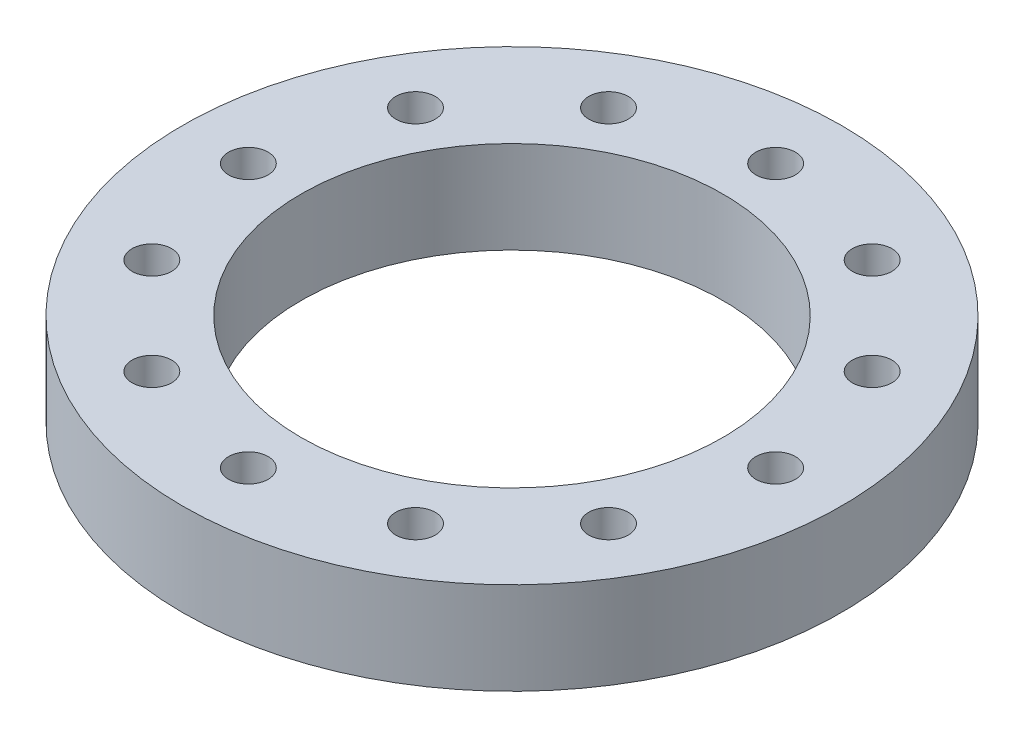
ISO-10303-21;
HEADER;
FILE_DESCRIPTION(('STEP AP214'),'2;1');
FILE_NAME('part.step','',(''),(''),'','','');
FILE_SCHEMA(('AUTOMOTIVE_DESIGN { 1 0 10303 214 1 1 1 1 }'));
ENDSEC;
DATA;
#1=APPLICATION_CONTEXT('core data for automotive mechanical design processes');
#2=APPLICATION_PROTOCOL_DEFINITION('international standard','automotive_design',2000,#1);
#3=PRODUCT_CONTEXT('',#1,'mechanical');
#4=PRODUCT('Part','Part','',(#3));
#5=PRODUCT_RELATED_PRODUCT_CATEGORY('part','',(#4));
#6=PRODUCT_DEFINITION_FORMATION('','',#4);
#7=PRODUCT_DEFINITION_CONTEXT('part definition',#1,'design');
#8=PRODUCT_DEFINITION('design','',#6,#7);
#9=PRODUCT_DEFINITION_SHAPE('','',#8);
#10=(LENGTH_UNIT() NAMED_UNIT(*) SI_UNIT(.MILLI.,.METRE.));
#11=(NAMED_UNIT(*) PLANE_ANGLE_UNIT() SI_UNIT($,.RADIAN.));
#12=(NAMED_UNIT(*) SI_UNIT($,.STERADIAN.) SOLID_ANGLE_UNIT());
#13=UNCERTAINTY_MEASURE_WITH_UNIT(LENGTH_MEASURE(1.E-05),#10,'distance_accuracy_value','');
#14=(GEOMETRIC_REPRESENTATION_CONTEXT(3) GLOBAL_UNCERTAINTY_ASSIGNED_CONTEXT((#13)) GLOBAL_UNIT_ASSIGNED_CONTEXT((#10,
#11,#12)) REPRESENTATION_CONTEXT('',''));
#15=CARTESIAN_POINT('',(0.,0.,0.));
#16=DIRECTION('',(0.,0.,1.));
#17=DIRECTION('',(1.,0.,0.));
#18=AXIS2_PLACEMENT_3D('',#15,#16,#17);
#19=CARTESIAN_POINT('',(0.,7.,0.));
#20=DIRECTION('',(0.,1.,0.));
#21=DIRECTION('',(0.,0.,1.));
#22=AXIS2_PLACEMENT_3D('',#19,#20,#21);
#23=PLANE('',#22);
#24=CARTESIAN_POINT('',(-17.3205080756887,7.,-10.0000000000002));
#25=DIRECTION('',(0.,1.,0.));
#26=DIRECTION('',(0.,0.,1.));
#27=AXIS2_PLACEMENT_3D('',#24,#25,#26);
#28=CIRCLE('',#27,1.5);
#29=CARTESIAN_POINT('',(-17.3205080756887,7.,-8.5000000000002));
#30=VERTEX_POINT('',#29);
#31=EDGE_CURVE('E142',#30,#30,#28,.T.);
#32=ORIENTED_EDGE('',*,*,#31,.F.);
#33=EDGE_LOOP('',(#32));
#34=FACE_BOUND('',#33,.T.);
#35=CARTESIAN_POINT('',(-17.3205080756889,7.,9.99999999999984));
#36=DIRECTION('',(0.,1.,0.));
#37=DIRECTION('',(0.,0.,1.));
#38=AXIS2_PLACEMENT_3D('',#35,#36,#37);
#39=CIRCLE('',#38,1.5);
#40=CARTESIAN_POINT('',(-17.3205080756889,7.,11.4999999999998));
#41=VERTEX_POINT('',#40);
#42=EDGE_CURVE('E126',#41,#41,#39,.T.);
#43=ORIENTED_EDGE('',*,*,#42,.F.);
#44=EDGE_LOOP('',(#43));
#45=FACE_BOUND('',#44,.T.);
#46=CARTESIAN_POINT('',(-1.39659253553725E-13,7.,20.));
#47=DIRECTION('',(0.,1.,0.));
#48=DIRECTION('',(0.,0.,1.));
#49=AXIS2_PLACEMENT_3D('',#46,#47,#48);
#50=CIRCLE('',#49,1.5);
#51=CARTESIAN_POINT('',(-1.39659253553725E-13,7.,21.5));
#52=VERTEX_POINT('',#51);
#53=EDGE_CURVE('E110',#52,#52,#50,.T.);
#54=ORIENTED_EDGE('',*,*,#53,.F.);
#55=EDGE_LOOP('',(#54));
#56=FACE_BOUND('',#55,.T.);
#57=CARTESIAN_POINT('',(17.3205080756887,7.,10.0000000000001));
#58=DIRECTION('',(0.,1.,0.));
#59=DIRECTION('',(0.,0.,1.));
#60=AXIS2_PLACEMENT_3D('',#57,#58,#59);
#61=CIRCLE('',#60,1.5);
#62=CARTESIAN_POINT('',(17.3205080756887,7.,11.5000000000001));
#63=VERTEX_POINT('',#62);
#64=EDGE_CURVE('E94',#63,#63,#61,.T.);
#65=ORIENTED_EDGE('',*,*,#64,.F.);
#66=EDGE_LOOP('',(#65));
#67=FACE_BOUND('',#66,.T.);
#68=CARTESIAN_POINT('',(17.3205080756888,7.,-9.99999999999996));
#69=DIRECTION('',(0.,1.,0.));
#70=DIRECTION('',(0.,0.,1.));
#71=AXIS2_PLACEMENT_3D('',#68,#69,#70);
#72=CIRCLE('',#71,1.5);
#73=CARTESIAN_POINT('',(17.3205080756888,7.,-8.49999999999996));
#74=VERTEX_POINT('',#73);
#75=EDGE_CURVE('E78',#74,#74,#72,.T.);
#76=ORIENTED_EDGE('',*,*,#75,.F.);
#77=EDGE_LOOP('',(#76));
#78=FACE_BOUND('',#77,.T.);
#79=CARTESIAN_POINT('',(0.,7.,-20.));
#80=DIRECTION('',(0.,1.,0.));
#81=DIRECTION('',(0.,0.,1.));
#82=AXIS2_PLACEMENT_3D('',#79,#80,#81);
#83=CIRCLE('',#82,1.5);
#84=CARTESIAN_POINT('',(0.,7.,-18.5));
#85=VERTEX_POINT('',#84);
#86=EDGE_CURVE('E62',#85,#85,#83,.T.);
#87=ORIENTED_EDGE('',*,*,#86,.F.);
#88=EDGE_LOOP('',(#87));
#89=FACE_BOUND('',#88,.T.);
#90=CARTESIAN_POINT('',(0.,7.,0.));
#91=DIRECTION('',(0.,1.,0.));
#92=DIRECTION('',(0.,0.,1.));
#93=AXIS2_PLACEMENT_3D('',#90,#91,#92);
#94=CIRCLE('',#93,25.);
#95=CARTESIAN_POINT('',(0.,7.,25.));
#96=VERTEX_POINT('',#95);
#97=EDGE_CURVE('E10',#96,#96,#94,.T.);
#98=ORIENTED_EDGE('',*,*,#97,.T.);
#99=EDGE_LOOP('',(#98));
#100=FACE_BOUND('',#99,.T.);
#101=CARTESIAN_POINT('',(0.,7.,0.));
#102=DIRECTION('',(0.,1.,0.));
#103=DIRECTION('',(0.,0.,1.));
#104=AXIS2_PLACEMENT_3D('',#101,#102,#103);
#105=CIRCLE('',#104,16.);
#106=CARTESIAN_POINT('',(0.,7.,16.));
#107=VERTEX_POINT('',#106);
#108=EDGE_CURVE('E56',#107,#107,#105,.T.);
#109=ORIENTED_EDGE('',*,*,#108,.F.);
#110=EDGE_LOOP('',(#109));
#111=FACE_BOUND('',#110,.T.);
#112=CARTESIAN_POINT('',(10.,7.,-17.3205080756888));
#113=DIRECTION('',(0.,1.,0.));
#114=DIRECTION('',(0.,0.,1.));
#115=AXIS2_PLACEMENT_3D('',#112,#113,#114);
#116=CIRCLE('',#115,1.5);
#117=CARTESIAN_POINT('',(10.,7.,-15.8205080756888));
#118=VERTEX_POINT('',#117);
#119=EDGE_CURVE('E70',#118,#118,#116,.T.);
#120=ORIENTED_EDGE('',*,*,#119,.F.);
#121=EDGE_LOOP('',(#120));
#122=FACE_BOUND('',#121,.T.);
#123=CARTESIAN_POINT('',(20.,7.,0.));
#124=DIRECTION('',(0.,1.,0.));
#125=DIRECTION('',(0.,0.,1.));
#126=AXIS2_PLACEMENT_3D('',#123,#124,#125);
#127=CIRCLE('',#126,1.5);
#128=CARTESIAN_POINT('',(20.,7.,1.50000000000007));
#129=VERTEX_POINT('',#128);
#130=EDGE_CURVE('E86',#129,#129,#127,.T.);
#131=ORIENTED_EDGE('',*,*,#130,.F.);
#132=EDGE_LOOP('',(#131));
#133=FACE_BOUND('',#132,.T.);
#134=CARTESIAN_POINT('',(9.9999999999999,7.,17.3205080756888));
#135=DIRECTION('',(0.,1.,0.));
#136=DIRECTION('',(0.,0.,1.));
#137=AXIS2_PLACEMENT_3D('',#134,#135,#136);
#138=CIRCLE('',#137,1.5);
#139=CARTESIAN_POINT('',(9.9999999999999,7.,18.8205080756888));
#140=VERTEX_POINT('',#139);
#141=EDGE_CURVE('E102',#140,#140,#138,.T.);
#142=ORIENTED_EDGE('',*,*,#141,.F.);
#143=EDGE_LOOP('',(#142));
#144=FACE_BOUND('',#143,.T.);
#145=CARTESIAN_POINT('',(-10.0000000000001,7.,17.3205080756887));
#146=DIRECTION('',(0.,1.,0.));
#147=DIRECTION('',(0.,0.,1.));
#148=AXIS2_PLACEMENT_3D('',#145,#146,#147);
#149=CIRCLE('',#148,1.5);
#150=CARTESIAN_POINT('',(-10.0000000000001,7.,18.8205080756887));
#151=VERTEX_POINT('',#150);
#152=EDGE_CURVE('E118',#151,#151,#149,.T.);
#153=ORIENTED_EDGE('',*,*,#152,.F.);
#154=EDGE_LOOP('',(#153));
#155=FACE_BOUND('',#154,.T.);
#156=CARTESIAN_POINT('',(-20.,7.,-2.09488880330588E-13));
#157=DIRECTION('',(0.,1.,0.));
#158=DIRECTION('',(0.,0.,1.));
#159=AXIS2_PLACEMENT_3D('',#156,#157,#158);
#160=CIRCLE('',#159,1.5);
#161=CARTESIAN_POINT('',(-20.,7.,1.49999999999979));
#162=VERTEX_POINT('',#161);
#163=EDGE_CURVE('E134',#162,#162,#160,.T.);
#164=ORIENTED_EDGE('',*,*,#163,.F.);
#165=EDGE_LOOP('',(#164));
#166=FACE_BOUND('',#165,.T.);
#167=CARTESIAN_POINT('',(-9.99999999999978,7.,-17.3205080756889));
#168=DIRECTION('',(0.,1.,0.));
#169=DIRECTION('',(0.,0.,1.));
#170=AXIS2_PLACEMENT_3D('',#167,#168,#169);
#171=CIRCLE('',#170,1.5);
#172=CARTESIAN_POINT('',(-9.99999999999978,7.,-15.8205080756889));
#173=VERTEX_POINT('',#172);
#174=EDGE_CURVE('E150',#173,#173,#171,.T.);
#175=ORIENTED_EDGE('',*,*,#174,.F.);
#176=EDGE_LOOP('',(#175));
#177=FACE_BOUND('',#176,.T.);
#178=ADVANCED_FACE('F43',(#34,#45,#56,#67,#78,#89,#100,#111,#122,#133,#144,#155,#166,#177),#23,.T.);
#179=CARTESIAN_POINT('',(0.,0.,0.));
#180=DIRECTION('',(0.,1.,0.));
#181=DIRECTION('',(0.,0.,1.));
#182=AXIS2_PLACEMENT_3D('',#179,#180,#181);
#183=PLANE('',#182);
#184=CARTESIAN_POINT('',(0.,0.,0.));
#185=DIRECTION('',(0.,1.,0.));
#186=DIRECTION('',(0.,0.,1.));
#187=AXIS2_PLACEMENT_3D('',#184,#185,#186);
#188=CIRCLE('',#187,25.);
#189=CARTESIAN_POINT('',(0.,0.,25.));
#190=VERTEX_POINT('',#189);
#191=EDGE_CURVE('E47',#190,#190,#188,.T.);
#192=ORIENTED_EDGE('',*,*,#191,.F.);
#193=EDGE_LOOP('',(#192));
#194=FACE_BOUND('',#193,.T.);
#195=CARTESIAN_POINT('',(0.,0.,0.));
#196=DIRECTION('',(0.,1.,0.));
#197=DIRECTION('',(0.,0.,1.));
#198=AXIS2_PLACEMENT_3D('',#195,#196,#197);
#199=CIRCLE('',#198,16.);
#200=CARTESIAN_POINT('',(0.,0.,16.));
#201=VERTEX_POINT('',#200);
#202=EDGE_CURVE('E58',#201,#201,#199,.T.);
#203=ORIENTED_EDGE('',*,*,#202,.T.);
#204=EDGE_LOOP('',(#203));
#205=FACE_BOUND('',#204,.T.);
#206=CARTESIAN_POINT('',(0.,0.,-20.));
#207=DIRECTION('',(0.,1.,0.));
#208=DIRECTION('',(0.,0.,1.));
#209=AXIS2_PLACEMENT_3D('',#206,#207,#208);
#210=CIRCLE('',#209,1.5);
#211=CARTESIAN_POINT('',(0.,0.,-18.5));
#212=VERTEX_POINT('',#211);
#213=EDGE_CURVE('E66',#212,#212,#210,.T.);
#214=ORIENTED_EDGE('',*,*,#213,.T.);
#215=EDGE_LOOP('',(#214));
#216=FACE_BOUND('',#215,.T.);
#217=CARTESIAN_POINT('',(10.,0.,-17.3205080756888));
#218=DIRECTION('',(0.,1.,0.));
#219=DIRECTION('',(0.,0.,1.));
#220=AXIS2_PLACEMENT_3D('',#217,#218,#219);
#221=CIRCLE('',#220,1.5);
#222=CARTESIAN_POINT('',(10.,0.,-15.8205080756888));
#223=VERTEX_POINT('',#222);
#224=EDGE_CURVE('E74',#223,#223,#221,.T.);
#225=ORIENTED_EDGE('',*,*,#224,.T.);
#226=EDGE_LOOP('',(#225));
#227=FACE_BOUND('',#226,.T.);
#228=CARTESIAN_POINT('',(17.3205080756888,0.,-9.99999999999996));
#229=DIRECTION('',(0.,1.,0.));
#230=DIRECTION('',(0.,0.,1.));
#231=AXIS2_PLACEMENT_3D('',#228,#229,#230);
#232=CIRCLE('',#231,1.5);
#233=CARTESIAN_POINT('',(17.3205080756888,0.,-8.49999999999996));
#234=VERTEX_POINT('',#233);
#235=EDGE_CURVE('E82',#234,#234,#232,.T.);
#236=ORIENTED_EDGE('',*,*,#235,.T.);
#237=EDGE_LOOP('',(#236));
#238=FACE_BOUND('',#237,.T.);
#239=CARTESIAN_POINT('',(20.,0.,0.));
#240=DIRECTION('',(0.,1.,0.));
#241=DIRECTION('',(0.,0.,1.));
#242=AXIS2_PLACEMENT_3D('',#239,#240,#241);
#243=CIRCLE('',#242,1.5);
#244=CARTESIAN_POINT('',(20.,0.,1.50000000000007));
#245=VERTEX_POINT('',#244);
#246=EDGE_CURVE('E90',#245,#245,#243,.T.);
#247=ORIENTED_EDGE('',*,*,#246,.T.);
#248=EDGE_LOOP('',(#247));
#249=FACE_BOUND('',#248,.T.);
#250=CARTESIAN_POINT('',(17.3205080756887,0.,10.0000000000001));
#251=DIRECTION('',(0.,1.,0.));
#252=DIRECTION('',(0.,0.,1.));
#253=AXIS2_PLACEMENT_3D('',#250,#251,#252);
#254=CIRCLE('',#253,1.5);
#255=CARTESIAN_POINT('',(17.3205080756887,0.,11.5000000000001));
#256=VERTEX_POINT('',#255);
#257=EDGE_CURVE('E98',#256,#256,#254,.T.);
#258=ORIENTED_EDGE('',*,*,#257,.T.);
#259=EDGE_LOOP('',(#258));
#260=FACE_BOUND('',#259,.T.);
#261=CARTESIAN_POINT('',(9.9999999999999,0.,17.3205080756888));
#262=DIRECTION('',(0.,1.,0.));
#263=DIRECTION('',(0.,0.,1.));
#264=AXIS2_PLACEMENT_3D('',#261,#262,#263);
#265=CIRCLE('',#264,1.5);
#266=CARTESIAN_POINT('',(9.9999999999999,0.,18.8205080756888));
#267=VERTEX_POINT('',#266);
#268=EDGE_CURVE('E106',#267,#267,#265,.T.);
#269=ORIENTED_EDGE('',*,*,#268,.T.);
#270=EDGE_LOOP('',(#269));
#271=FACE_BOUND('',#270,.T.);
#272=CARTESIAN_POINT('',(-1.39659253553725E-13,0.,20.));
#273=DIRECTION('',(0.,1.,0.));
#274=DIRECTION('',(0.,0.,1.));
#275=AXIS2_PLACEMENT_3D('',#272,#273,#274);
#276=CIRCLE('',#275,1.5);
#277=CARTESIAN_POINT('',(-1.39659253553725E-13,0.,21.5));
#278=VERTEX_POINT('',#277);
#279=EDGE_CURVE('E114',#278,#278,#276,.T.);
#280=ORIENTED_EDGE('',*,*,#279,.T.);
#281=EDGE_LOOP('',(#280));
#282=FACE_BOUND('',#281,.T.);
#283=CARTESIAN_POINT('',(-10.0000000000001,0.,17.3205080756887));
#284=DIRECTION('',(0.,1.,0.));
#285=DIRECTION('',(0.,0.,1.));
#286=AXIS2_PLACEMENT_3D('',#283,#284,#285);
#287=CIRCLE('',#286,1.5);
#288=CARTESIAN_POINT('',(-10.0000000000001,0.,18.8205080756887));
#289=VERTEX_POINT('',#288);
#290=EDGE_CURVE('E122',#289,#289,#287,.T.);
#291=ORIENTED_EDGE('',*,*,#290,.T.);
#292=EDGE_LOOP('',(#291));
#293=FACE_BOUND('',#292,.T.);
#294=CARTESIAN_POINT('',(-17.3205080756889,0.,9.99999999999984));
#295=DIRECTION('',(0.,1.,0.));
#296=DIRECTION('',(0.,0.,1.));
#297=AXIS2_PLACEMENT_3D('',#294,#295,#296);
#298=CIRCLE('',#297,1.5);
#299=CARTESIAN_POINT('',(-17.3205080756889,0.,11.4999999999998));
#300=VERTEX_POINT('',#299);
#301=EDGE_CURVE('E130',#300,#300,#298,.T.);
#302=ORIENTED_EDGE('',*,*,#301,.T.);
#303=EDGE_LOOP('',(#302));
#304=FACE_BOUND('',#303,.T.);
#305=CARTESIAN_POINT('',(-20.,0.,-2.09488880330588E-13));
#306=DIRECTION('',(0.,1.,0.));
#307=DIRECTION('',(0.,0.,1.));
#308=AXIS2_PLACEMENT_3D('',#305,#306,#307);
#309=CIRCLE('',#308,1.5);
#310=CARTESIAN_POINT('',(-20.,0.,1.49999999999979));
#311=VERTEX_POINT('',#310);
#312=EDGE_CURVE('E138',#311,#311,#309,.T.);
#313=ORIENTED_EDGE('',*,*,#312,.T.);
#314=EDGE_LOOP('',(#313));
#315=FACE_BOUND('',#314,.T.);
#316=CARTESIAN_POINT('',(-17.3205080756887,0.,-10.0000000000002));
#317=DIRECTION('',(0.,1.,0.));
#318=DIRECTION('',(0.,0.,1.));
#319=AXIS2_PLACEMENT_3D('',#316,#317,#318);
#320=CIRCLE('',#319,1.5);
#321=CARTESIAN_POINT('',(-17.3205080756887,0.,-8.5000000000002));
#322=VERTEX_POINT('',#321);
#323=EDGE_CURVE('E146',#322,#322,#320,.T.);
#324=ORIENTED_EDGE('',*,*,#323,.T.);
#325=EDGE_LOOP('',(#324));
#326=FACE_BOUND('',#325,.T.);
#327=CARTESIAN_POINT('',(-9.99999999999978,0.,-17.3205080756889));
#328=DIRECTION('',(0.,1.,0.));
#329=DIRECTION('',(0.,0.,1.));
#330=AXIS2_PLACEMENT_3D('',#327,#328,#329);
#331=CIRCLE('',#330,1.5);
#332=CARTESIAN_POINT('',(-9.99999999999978,0.,-15.8205080756889));
#333=VERTEX_POINT('',#332);
#334=EDGE_CURVE('E154',#333,#333,#331,.T.);
#335=ORIENTED_EDGE('',*,*,#334,.T.);
#336=EDGE_LOOP('',(#335));
#337=FACE_BOUND('',#336,.T.);
#338=ADVANCED_FACE('F166',(#194,#205,#216,#227,#238,#249,#260,#271,#282,#293,#304,#315,#326,
#337),#183,.F.);
#339=CARTESIAN_POINT('',(0.,7.,0.));
#340=DIRECTION('',(0.,-1.,0.));
#341=DIRECTION('',(0.,0.,-1.));
#342=AXIS2_PLACEMENT_3D('',#339,#340,#341);
#343=CYLINDRICAL_SURFACE('',#342,25.);
#344=ORIENTED_EDGE('',*,*,#97,.F.);
#345=EDGE_LOOP('',(#344));
#346=FACE_BOUND('',#345,.T.);
#347=ORIENTED_EDGE('',*,*,#191,.T.);
#348=EDGE_LOOP('',(#347));
#349=FACE_BOUND('',#348,.T.);
#350=ADVANCED_FACE('F45',(#346,#349),#343,.T.);
#351=CARTESIAN_POINT('',(0.,7.,0.));
#352=DIRECTION('',(0.,-1.,0.));
#353=DIRECTION('',(0.,0.,-1.));
#354=AXIS2_PLACEMENT_3D('',#351,#352,#353);
#355=CYLINDRICAL_SURFACE('',#354,16.);
#356=ORIENTED_EDGE('',*,*,#108,.T.);
#357=EDGE_LOOP('',(#356));
#358=FACE_BOUND('',#357,.T.);
#359=ORIENTED_EDGE('',*,*,#202,.F.);
#360=EDGE_LOOP('',(#359));
#361=FACE_BOUND('',#360,.T.);
#362=ADVANCED_FACE('F176',(#358,#361),#355,.F.);
#363=CARTESIAN_POINT('',(0.,7.,-20.));
#364=DIRECTION('',(0.,-1.,0.));
#365=DIRECTION('',(0.,0.,-1.));
#366=AXIS2_PLACEMENT_3D('',#363,#364,#365);
#367=CYLINDRICAL_SURFACE('',#366,1.5);
#368=ORIENTED_EDGE('',*,*,#86,.T.);
#369=EDGE_LOOP('',(#368));
#370=FACE_BOUND('',#369,.T.);
#371=ORIENTED_EDGE('',*,*,#213,.F.);
#372=EDGE_LOOP('',(#371));
#373=FACE_BOUND('',#372,.T.);
#374=ADVANCED_FACE('F179',(#370,#373),#367,.F.);
#375=CARTESIAN_POINT('',(10.,7.,-17.3205080756888));
#376=DIRECTION('',(0.,-1.,0.));
#377=DIRECTION('',(0.,0.,-1.));
#378=AXIS2_PLACEMENT_3D('',#375,#376,#377);
#379=CYLINDRICAL_SURFACE('',#378,1.5);
#380=ORIENTED_EDGE('',*,*,#119,.T.);
#381=EDGE_LOOP('',(#380));
#382=FACE_BOUND('',#381,.T.);
#383=ORIENTED_EDGE('',*,*,#224,.F.);
#384=EDGE_LOOP('',(#383));
#385=FACE_BOUND('',#384,.T.);
#386=ADVANCED_FACE('F183',(#382,#385),#379,.F.);
#387=CARTESIAN_POINT('',(17.3205080756888,7.,-9.99999999999996));
#388=DIRECTION('',(0.,-1.,0.));
#389=DIRECTION('',(0.,0.,-1.));
#390=AXIS2_PLACEMENT_3D('',#387,#388,#389);
#391=CYLINDRICAL_SURFACE('',#390,1.5);
#392=ORIENTED_EDGE('',*,*,#75,.T.);
#393=EDGE_LOOP('',(#392));
#394=FACE_BOUND('',#393,.T.);
#395=ORIENTED_EDGE('',*,*,#235,.F.);
#396=EDGE_LOOP('',(#395));
#397=FACE_BOUND('',#396,.T.);
#398=ADVANCED_FACE('F187',(#394,#397),#391,.F.);
#399=CARTESIAN_POINT('',(20.,7.,0.));
#400=DIRECTION('',(0.,-1.,0.));
#401=DIRECTION('',(0.,0.,-1.));
#402=AXIS2_PLACEMENT_3D('',#399,#400,#401);
#403=CYLINDRICAL_SURFACE('',#402,1.5);
#404=ORIENTED_EDGE('',*,*,#130,.T.);
#405=EDGE_LOOP('',(#404));
#406=FACE_BOUND('',#405,.T.);
#407=ORIENTED_EDGE('',*,*,#246,.F.);
#408=EDGE_LOOP('',(#407));
#409=FACE_BOUND('',#408,.T.);
#410=ADVANCED_FACE('F191',(#406,#409),#403,.F.);
#411=CARTESIAN_POINT('',(17.3205080756887,7.,10.0000000000001));
#412=DIRECTION('',(0.,-1.,0.));
#413=DIRECTION('',(0.,0.,-1.));
#414=AXIS2_PLACEMENT_3D('',#411,#412,#413);
#415=CYLINDRICAL_SURFACE('',#414,1.5);
#416=ORIENTED_EDGE('',*,*,#64,.T.);
#417=EDGE_LOOP('',(#416));
#418=FACE_BOUND('',#417,.T.);
#419=ORIENTED_EDGE('',*,*,#257,.F.);
#420=EDGE_LOOP('',(#419));
#421=FACE_BOUND('',#420,.T.);
#422=ADVANCED_FACE('F195',(#418,#421),#415,.F.);
#423=CARTESIAN_POINT('',(9.9999999999999,7.,17.3205080756888));
#424=DIRECTION('',(0.,-1.,0.));
#425=DIRECTION('',(0.,0.,-1.));
#426=AXIS2_PLACEMENT_3D('',#423,#424,#425);
#427=CYLINDRICAL_SURFACE('',#426,1.5);
#428=ORIENTED_EDGE('',*,*,#141,.T.);
#429=EDGE_LOOP('',(#428));
#430=FACE_BOUND('',#429,.T.);
#431=ORIENTED_EDGE('',*,*,#268,.F.);
#432=EDGE_LOOP('',(#431));
#433=FACE_BOUND('',#432,.T.);
#434=ADVANCED_FACE('F199',(#430,#433),#427,.F.);
#435=CARTESIAN_POINT('',(-1.39659253553725E-13,7.,20.));
#436=DIRECTION('',(0.,-1.,0.));
#437=DIRECTION('',(0.,0.,-1.));
#438=AXIS2_PLACEMENT_3D('',#435,#436,#437);
#439=CYLINDRICAL_SURFACE('',#438,1.5);
#440=ORIENTED_EDGE('',*,*,#53,.T.);
#441=EDGE_LOOP('',(#440));
#442=FACE_BOUND('',#441,.T.);
#443=ORIENTED_EDGE('',*,*,#279,.F.);
#444=EDGE_LOOP('',(#443));
#445=FACE_BOUND('',#444,.T.);
#446=ADVANCED_FACE('F203',(#442,#445),#439,.F.);
#447=CARTESIAN_POINT('',(-10.0000000000001,7.,17.3205080756887));
#448=DIRECTION('',(0.,-1.,0.));
#449=DIRECTION('',(0.,0.,-1.));
#450=AXIS2_PLACEMENT_3D('',#447,#448,#449);
#451=CYLINDRICAL_SURFACE('',#450,1.5);
#452=ORIENTED_EDGE('',*,*,#152,.T.);
#453=EDGE_LOOP('',(#452));
#454=FACE_BOUND('',#453,.T.);
#455=ORIENTED_EDGE('',*,*,#290,.F.);
#456=EDGE_LOOP('',(#455));
#457=FACE_BOUND('',#456,.T.);
#458=ADVANCED_FACE('F207',(#454,#457),#451,.F.);
#459=CARTESIAN_POINT('',(-17.3205080756889,7.,9.99999999999984));
#460=DIRECTION('',(0.,-1.,0.));
#461=DIRECTION('',(0.,0.,-1.));
#462=AXIS2_PLACEMENT_3D('',#459,#460,#461);
#463=CYLINDRICAL_SURFACE('',#462,1.5);
#464=ORIENTED_EDGE('',*,*,#42,.T.);
#465=EDGE_LOOP('',(#464));
#466=FACE_BOUND('',#465,.T.);
#467=ORIENTED_EDGE('',*,*,#301,.F.);
#468=EDGE_LOOP('',(#467));
#469=FACE_BOUND('',#468,.T.);
#470=ADVANCED_FACE('F211',(#466,#469),#463,.F.);
#471=CARTESIAN_POINT('',(-20.,7.,-2.09488880330588E-13));
#472=DIRECTION('',(0.,-1.,0.));
#473=DIRECTION('',(0.,0.,-1.));
#474=AXIS2_PLACEMENT_3D('',#471,#472,#473);
#475=CYLINDRICAL_SURFACE('',#474,1.5);
#476=ORIENTED_EDGE('',*,*,#163,.T.);
#477=EDGE_LOOP('',(#476));
#478=FACE_BOUND('',#477,.T.);
#479=ORIENTED_EDGE('',*,*,#312,.F.);
#480=EDGE_LOOP('',(#479));
#481=FACE_BOUND('',#480,.T.);
#482=ADVANCED_FACE('F215',(#478,#481),#475,.F.);
#483=CARTESIAN_POINT('',(-17.3205080756887,7.,-10.0000000000002));
#484=DIRECTION('',(0.,-1.,0.));
#485=DIRECTION('',(0.,0.,-1.));
#486=AXIS2_PLACEMENT_3D('',#483,#484,#485);
#487=CYLINDRICAL_SURFACE('',#486,1.5);
#488=ORIENTED_EDGE('',*,*,#31,.T.);
#489=EDGE_LOOP('',(#488));
#490=FACE_BOUND('',#489,.T.);
#491=ORIENTED_EDGE('',*,*,#323,.F.);
#492=EDGE_LOOP('',(#491));
#493=FACE_BOUND('',#492,.T.);
#494=ADVANCED_FACE('F219',(#490,#493),#487,.F.);
#495=CARTESIAN_POINT('',(-9.99999999999978,7.,-17.3205080756889));
#496=DIRECTION('',(0.,-1.,0.));
#497=DIRECTION('',(0.,0.,-1.));
#498=AXIS2_PLACEMENT_3D('',#495,#496,#497);
#499=CYLINDRICAL_SURFACE('',#498,1.5);
#500=ORIENTED_EDGE('',*,*,#174,.T.);
#501=EDGE_LOOP('',(#500));
#502=FACE_BOUND('',#501,.T.);
#503=ORIENTED_EDGE('',*,*,#334,.F.);
#504=EDGE_LOOP('',(#503));
#505=FACE_BOUND('',#504,.T.);
#506=ADVANCED_FACE('F162',(#502,#505),#499,.F.);
#507=CLOSED_SHELL('',(#178,#338,#350,#362,#374,#386,#398,#410,#422,#434,#446,#458,#470,#482,
#494,#506));
#508=MANIFOLD_SOLID_BREP('B2',#507);
#509=ADVANCED_BREP_SHAPE_REPRESENTATION('',(#18,#508),#14);
#510=SHAPE_DEFINITION_REPRESENTATION(#9,#509);
ENDSEC;
END-ISO-10303-21;
